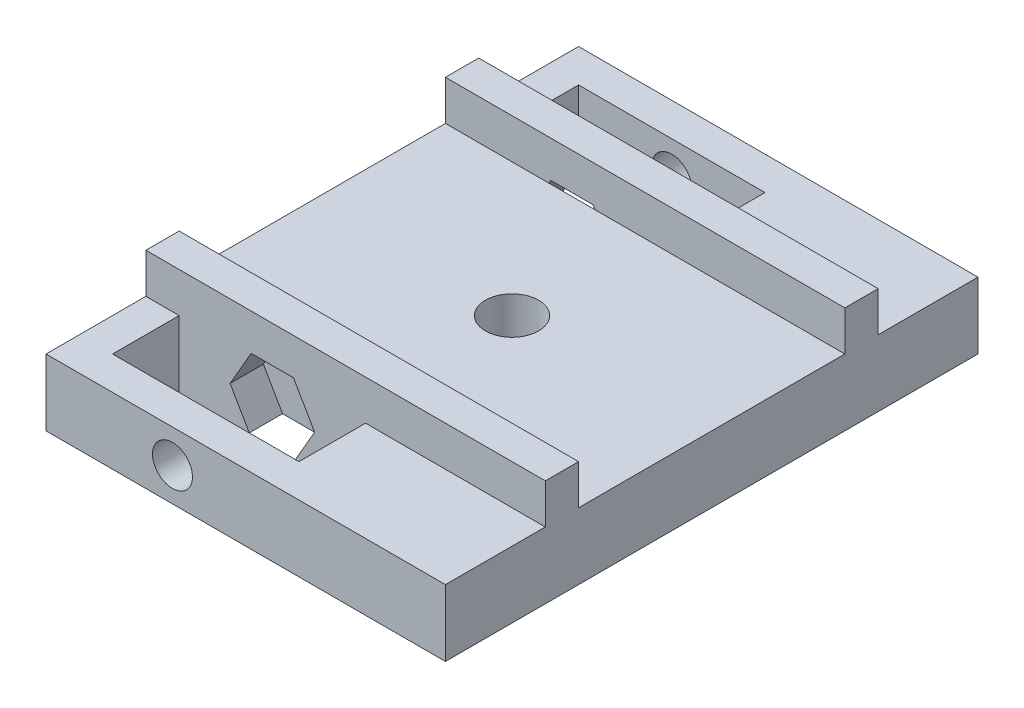
ISO-10303-21;
HEADER;
FILE_DESCRIPTION(('STEP AP214'),'2;1');
FILE_NAME('part.step','',(''),(''),'','','');
FILE_SCHEMA(('AUTOMOTIVE_DESIGN { 1 0 10303 214 1 1 1 1 }'));
ENDSEC;
DATA;
#1=APPLICATION_CONTEXT('core data for automotive mechanical design processes');
#2=APPLICATION_PROTOCOL_DEFINITION('international standard','automotive_design',2000,#1);
#3=PRODUCT_CONTEXT('',#1,'mechanical');
#4=PRODUCT('Part','Part','',(#3));
#5=PRODUCT_RELATED_PRODUCT_CATEGORY('part','',(#4));
#6=PRODUCT_DEFINITION_FORMATION('','',#4);
#7=PRODUCT_DEFINITION_CONTEXT('part definition',#1,'design');
#8=PRODUCT_DEFINITION('design','',#6,#7);
#9=PRODUCT_DEFINITION_SHAPE('','',#8);
#10=(LENGTH_UNIT() NAMED_UNIT(*) SI_UNIT(.MILLI.,.METRE.));
#11=(NAMED_UNIT(*) PLANE_ANGLE_UNIT() SI_UNIT($,.RADIAN.));
#12=(NAMED_UNIT(*) SI_UNIT($,.STERADIAN.) SOLID_ANGLE_UNIT());
#13=UNCERTAINTY_MEASURE_WITH_UNIT(LENGTH_MEASURE(1.E-05),#10,'distance_accuracy_value','');
#14=(GEOMETRIC_REPRESENTATION_CONTEXT(3) GLOBAL_UNCERTAINTY_ASSIGNED_CONTEXT((#13)) GLOBAL_UNIT_ASSIGNED_CONTEXT((#10,
#11,#12)) REPRESENTATION_CONTEXT('',''));
#15=CARTESIAN_POINT('',(0.,0.,0.));
#16=DIRECTION('',(0.,0.,1.));
#17=DIRECTION('',(1.,0.,0.));
#18=AXIS2_PLACEMENT_3D('',#15,#16,#17);
#19=CARTESIAN_POINT('',(0.,5.,0.));
#20=DIRECTION('',(0.,1.,0.));
#21=DIRECTION('',(0.,0.,1.));
#22=AXIS2_PLACEMENT_3D('',#19,#20,#21);
#23=PLANE('',#22);
#24=CARTESIAN_POINT('',(-15.,5.,10.));
#25=DIRECTION('',(0.,1.,0.));
#26=DIRECTION('',(0.,0.,1.));
#27=AXIS2_PLACEMENT_3D('',#24,#25,#26);
#28=CIRCLE('',#27,2.);
#29=CARTESIAN_POINT('',(-15.,5.,12.));
#30=VERTEX_POINT('',#29);
#31=EDGE_CURVE('E290',#30,#30,#28,.T.);
#32=ORIENTED_EDGE('',*,*,#31,.F.);
#33=EDGE_LOOP('',(#32));
#34=FACE_BOUND('',#33,.T.);
#35=DIRECTION('',(1.,0.,0.));
#36=VECTOR('',#35,1.);
#37=CARTESIAN_POINT('',(0.,5.,0.));
#38=LINE('',#37,#36);
#39=CARTESIAN_POINT('',(-18.7679491924311,5.,0.));
#40=VERTEX_POINT('',#39);
#41=CARTESIAN_POINT('',(0.,5.,0.));
#42=VERTEX_POINT('',#41);
#43=EDGE_CURVE('E437',#40,#42,#38,.T.);
#44=ORIENTED_EDGE('',*,*,#43,.F.);
#45=DIRECTION('',(-1.,0.,0.));
#46=VECTOR('',#45,1.);
#47=CARTESIAN_POINT('',(0.,5.,0.));
#48=LINE('',#47,#46);
#49=CARTESIAN_POINT('',(-22.2320508075689,5.,0.));
#50=VERTEX_POINT('',#49);
#51=EDGE_CURVE('E287',#40,#50,#48,.T.);
#52=ORIENTED_EDGE('',*,*,#51,.T.);
#53=CARTESIAN_POINT('',(-30.,5.,0.));
#54=VERTEX_POINT('',#53);
#55=EDGE_CURVE('E438',#54,#50,#38,.T.);
#56=ORIENTED_EDGE('',*,*,#55,.F.);
#57=DIRECTION('',(0.,0.,1.));
#58=VECTOR('',#57,1.);
#59=CARTESIAN_POINT('',(-30.,5.,0.));
#60=LINE('',#59,#58);
#61=CARTESIAN_POINT('',(-30.,5.,20.));
#62=VERTEX_POINT('',#61);
#63=EDGE_CURVE('E470',#54,#62,#60,.T.);
#64=ORIENTED_EDGE('',*,*,#63,.T.);
#65=DIRECTION('',(1.,0.,0.));
#66=VECTOR('',#65,1.);
#67=CARTESIAN_POINT('',(0.,5.,20.));
#68=LINE('',#67,#66);
#69=CARTESIAN_POINT('',(-22.2320508075689,5.,20.));
#70=VERTEX_POINT('',#69);
#71=EDGE_CURVE('E462',#62,#70,#68,.T.);
#72=ORIENTED_EDGE('',*,*,#71,.T.);
#73=CARTESIAN_POINT('',(-18.7679491924311,5.,20.));
#74=VERTEX_POINT('',#73);
#75=EDGE_CURVE('E466',#70,#74,#68,.T.);
#76=ORIENTED_EDGE('',*,*,#75,.T.);
#77=CARTESIAN_POINT('',(0.,5.,20.));
#78=VERTEX_POINT('',#77);
#79=EDGE_CURVE('E461',#74,#78,#68,.T.);
#80=ORIENTED_EDGE('',*,*,#79,.T.);
#81=DIRECTION('',(0.,0.,1.));
#82=VECTOR('',#81,1.);
#83=CARTESIAN_POINT('',(0.,5.,0.));
#84=LINE('',#83,#82);
#85=EDGE_CURVE('E475',#42,#78,#84,.T.);
#86=ORIENTED_EDGE('',*,*,#85,.F.);
#87=EDGE_LOOP('',(#44,#52,#56,#64,#72,#76,#80,#86));
#88=FACE_BOUND('',#87,.T.);
#89=ADVANCED_FACE('F36',(#34,#88),#23,.T.);
#90=CARTESIAN_POINT('',(0.,5.,22.5));
#91=DIRECTION('',(0.,0.,1.));
#92=DIRECTION('',(1.,0.,0.));
#93=AXIS2_PLACEMENT_3D('',#90,#91,#92);
#94=PLANE('',#93);
#95=DIRECTION('',(-1.,0.,0.));
#96=VECTOR('',#95,1.);
#97=CARTESIAN_POINT('',(0.,0.,22.5));
#98=LINE('',#97,#96);
#99=CARTESIAN_POINT('',(-22.2320508075689,0.,22.5));
#100=VERTEX_POINT('',#99);
#101=CARTESIAN_POINT('',(-27.5,0.,22.5));
#102=VERTEX_POINT('',#101);
#103=EDGE_CURVE('E492',#100,#102,#98,.T.);
#104=ORIENTED_EDGE('',*,*,#103,.F.);
#105=DIRECTION('',(-0.5,0.866025403784439,0.));
#106=VECTOR('',#105,1.);
#107=CARTESIAN_POINT('',(-16.6740381056767,-9.6267603887905,22.5));
#108=LINE('',#107,#106);
#109=CARTESIAN_POINT('',(-23.675426480543,2.5,22.5));
#110=VERTEX_POINT('',#109);
#111=EDGE_CURVE('E302',#100,#110,#108,.T.);
#112=ORIENTED_EDGE('',*,*,#111,.T.);
#113=DIRECTION('',(0.499999999999999,0.866025403784439,0.));
#114=VECTOR('',#113,1.);
#115=CARTESIAN_POINT('',(-18.8391016151378,10.8767603887905,22.5));
#116=LINE('',#115,#114);
#117=CARTESIAN_POINT('',(-22.0877132402715,5.25000000000002,22.5));
#118=VERTEX_POINT('',#117);
#119=EDGE_CURVE('E325',#110,#118,#116,.T.);
#120=ORIENTED_EDGE('',*,*,#119,.T.);
#121=DIRECTION('',(1.,0.,0.));
#122=VECTOR('',#121,1.);
#123=CARTESIAN_POINT('',(0.,5.25000000000002,22.5));
#124=LINE('',#123,#122);
#125=CARTESIAN_POINT('',(-18.9122867597285,5.25000000000002,22.5));
#126=VERTEX_POINT('',#125);
#127=EDGE_CURVE('E322',#118,#126,#124,.T.);
#128=ORIENTED_EDGE('',*,*,#127,.T.);
#129=DIRECTION('',(0.5,-0.866025403784438,0.));
#130=VECTOR('',#129,1.);
#131=CARTESIAN_POINT('',(-11.9108983848622,-6.87676038879049,22.5));
#132=LINE('',#131,#130);
#133=CARTESIAN_POINT('',(-17.324573519457,2.5,22.5));
#134=VERTEX_POINT('',#133);
#135=EDGE_CURVE('E319',#126,#134,#132,.T.);
#136=ORIENTED_EDGE('',*,*,#135,.T.);
#137=DIRECTION('',(-0.5,-0.866025403784439,0.));
#138=VECTOR('',#137,1.);
#139=CARTESIAN_POINT('',(-14.0759618943233,8.12676038879049,22.5));
#140=LINE('',#139,#138);
#141=CARTESIAN_POINT('',(-18.7679491924311,0.,22.5));
#142=VERTEX_POINT('',#141);
#143=EDGE_CURVE('E295',#134,#142,#140,.T.);
#144=ORIENTED_EDGE('',*,*,#143,.T.);
#145=CARTESIAN_POINT('',(-13.5,0.,22.5));
#146=VERTEX_POINT('',#145);
#147=EDGE_CURVE('E493',#146,#142,#98,.T.);
#148=ORIENTED_EDGE('',*,*,#147,.F.);
#149=DIRECTION('',(0.,-1.,0.));
#150=VECTOR('',#149,1.);
#151=CARTESIAN_POINT('',(-13.5,5.,22.5));
#152=LINE('',#151,#150);
#153=CARTESIAN_POINT('',(-13.5,5.,22.5));
#154=VERTEX_POINT('',#153);
#155=EDGE_CURVE('E383',#154,#146,#152,.T.);
#156=ORIENTED_EDGE('',*,*,#155,.F.);
#157=DIRECTION('',(-1.,0.,0.));
#158=VECTOR('',#157,1.);
#159=CARTESIAN_POINT('',(0.,5.,22.5));
#160=LINE('',#159,#158);
#161=CARTESIAN_POINT('',(0.,5.,22.5));
#162=VERTEX_POINT('',#161);
#163=EDGE_CURVE('E391',#162,#154,#160,.T.);
#164=ORIENTED_EDGE('',*,*,#163,.F.);
#165=DIRECTION('',(0.,-1.,0.));
#166=VECTOR('',#165,1.);
#167=CARTESIAN_POINT('',(0.,5.,22.5));
#168=LINE('',#167,#166);
#169=CARTESIAN_POINT('',(0.,8.,22.5));
#170=VERTEX_POINT('',#169);
#171=EDGE_CURVE('E520',#170,#162,#168,.T.);
#172=ORIENTED_EDGE('',*,*,#171,.F.);
#173=DIRECTION('',(-1.,0.,0.));
#174=VECTOR('',#173,1.);
#175=CARTESIAN_POINT('',(0.,8.,22.5));
#176=LINE('',#175,#174);
#177=CARTESIAN_POINT('',(-30.,8.,22.5));
#178=VERTEX_POINT('',#177);
#179=EDGE_CURVE('E447',#170,#178,#176,.T.);
#180=ORIENTED_EDGE('',*,*,#179,.T.);
#181=DIRECTION('',(0.,-1.,0.));
#182=VECTOR('',#181,1.);
#183=CARTESIAN_POINT('',(-30.,5.,22.5));
#184=LINE('',#183,#182);
#185=CARTESIAN_POINT('',(-30.,5.,22.5));
#186=VERTEX_POINT('',#185);
#187=EDGE_CURVE('E523',#178,#186,#184,.T.);
#188=ORIENTED_EDGE('',*,*,#187,.T.);
#189=CARTESIAN_POINT('',(-27.5,5.,22.5));
#190=VERTEX_POINT('',#189);
#191=EDGE_CURVE('E385',#190,#186,#160,.T.);
#192=ORIENTED_EDGE('',*,*,#191,.F.);
#193=DIRECTION('',(0.,-1.,0.));
#194=VECTOR('',#193,1.);
#195=CARTESIAN_POINT('',(-27.5,5.,22.5));
#196=LINE('',#195,#194);
#197=EDGE_CURVE('E375',#190,#102,#196,.T.);
#198=ORIENTED_EDGE('',*,*,#197,.T.);
#199=EDGE_LOOP('',(#104,#112,#120,#128,#136,#144,#148,#156,#164,#172,#180,#188,#192,#198));
#200=FACE_BOUND('',#199,.T.);
#201=ADVANCED_FACE('F574',(#200),#94,.T.);
#202=CARTESIAN_POINT('',(0.,0.,0.));
#203=DIRECTION('',(0.,1.,0.));
#204=DIRECTION('',(0.,0.,1.));
#205=AXIS2_PLACEMENT_3D('',#202,#203,#204);
#206=PLANE('',#205);
#207=CARTESIAN_POINT('',(-15.,0.,10.));
#208=DIRECTION('',(0.,1.,0.));
#209=DIRECTION('',(0.,0.,1.));
#210=AXIS2_PLACEMENT_3D('',#207,#208,#209);
#211=CIRCLE('',#210,2.);
#212=CARTESIAN_POINT('',(-15.,0.,12.));
#213=VERTEX_POINT('',#212);
#214=EDGE_CURVE('E292',#213,#213,#211,.T.);
#215=ORIENTED_EDGE('',*,*,#214,.T.);
#216=EDGE_LOOP('',(#215));
#217=FACE_BOUND('',#216,.T.);
#218=DIRECTION('',(-1.,0.,0.));
#219=VECTOR('',#218,1.);
#220=CARTESIAN_POINT('',(0.,0.,30.));
#221=LINE('',#220,#219);
#222=CARTESIAN_POINT('',(0.,0.,30.));
#223=VERTEX_POINT('',#222);
#224=CARTESIAN_POINT('',(-30.,0.,30.));
#225=VERTEX_POINT('',#224);
#226=EDGE_CURVE('E344',#223,#225,#221,.T.);
#227=ORIENTED_EDGE('',*,*,#226,.T.);
#228=DIRECTION('',(0.,0.,1.));
#229=VECTOR('',#228,1.);
#230=CARTESIAN_POINT('',(-30.,0.,0.));
#231=LINE('',#230,#229);
#232=CARTESIAN_POINT('',(-30.,0.,-10.));
#233=VERTEX_POINT('',#232);
#234=EDGE_CURVE('E490',#233,#225,#231,.T.);
#235=ORIENTED_EDGE('',*,*,#234,.F.);
#236=DIRECTION('',(-1.,0.,0.));
#237=VECTOR('',#236,1.);
#238=CARTESIAN_POINT('',(0.,0.,-10.));
#239=LINE('',#238,#237);
#240=CARTESIAN_POINT('',(0.,0.,-10.));
#241=VERTEX_POINT('',#240);
#242=EDGE_CURVE('E465',#241,#233,#239,.T.);
#243=ORIENTED_EDGE('',*,*,#242,.F.);
#244=DIRECTION('',(0.,0.,1.));
#245=VECTOR('',#244,1.);
#246=CARTESIAN_POINT('',(0.,0.,0.));
#247=LINE('',#246,#245);
#248=EDGE_CURVE('E496',#241,#223,#247,.T.);
#249=ORIENTED_EDGE('',*,*,#248,.T.);
#250=EDGE_LOOP('',(#227,#235,#243,#249));
#251=FACE_BOUND('',#250,.T.);
#252=DIRECTION('',(-1.,0.,0.));
#253=VECTOR('',#252,1.);
#254=CARTESIAN_POINT('',(0.,0.,0.));
#255=LINE('',#254,#253);
#256=CARTESIAN_POINT('',(-18.7679491924311,0.,0.));
#257=VERTEX_POINT('',#256);
#258=CARTESIAN_POINT('',(-22.2320508075689,0.,0.));
#259=VERTEX_POINT('',#258);
#260=EDGE_CURVE('E263',#257,#259,#255,.T.);
#261=ORIENTED_EDGE('',*,*,#260,.F.);
#262=DIRECTION('',(0.,0.,-1.));
#263=VECTOR('',#262,1.);
#264=CARTESIAN_POINT('',(-18.7679491924311,0.,0.));
#265=LINE('',#264,#263);
#266=CARTESIAN_POINT('',(-18.7679491924311,0.,-2.5));
#267=VERTEX_POINT('',#266);
#268=EDGE_CURVE('E291',#257,#267,#265,.T.);
#269=ORIENTED_EDGE('',*,*,#268,.T.);
#270=DIRECTION('',(1.,0.,0.));
#271=VECTOR('',#270,1.);
#272=CARTESIAN_POINT('',(0.,0.,-2.5));
#273=LINE('',#272,#271);
#274=CARTESIAN_POINT('',(-13.5,0.,-2.5));
#275=VERTEX_POINT('',#274);
#276=EDGE_CURVE('E498',#267,#275,#273,.T.);
#277=ORIENTED_EDGE('',*,*,#276,.T.);
#278=DIRECTION('',(0.,0.,-1.));
#279=VECTOR('',#278,1.);
#280=CARTESIAN_POINT('',(-13.5,0.,0.));
#281=LINE('',#280,#279);
#282=CARTESIAN_POINT('',(-13.5,0.,-7.5));
#283=VERTEX_POINT('',#282);
#284=EDGE_CURVE('E471',#275,#283,#281,.T.);
#285=ORIENTED_EDGE('',*,*,#284,.T.);
#286=DIRECTION('',(1.,0.,0.));
#287=VECTOR('',#286,1.);
#288=CARTESIAN_POINT('',(0.,0.,-7.5));
#289=LINE('',#288,#287);
#290=CARTESIAN_POINT('',(-27.5,0.,-7.5));
#291=VERTEX_POINT('',#290);
#292=EDGE_CURVE('E503',#291,#283,#289,.T.);
#293=ORIENTED_EDGE('',*,*,#292,.F.);
#294=DIRECTION('',(0.,0.,-1.));
#295=VECTOR('',#294,1.);
#296=CARTESIAN_POINT('',(-27.5,0.,0.));
#297=LINE('',#296,#295);
#298=CARTESIAN_POINT('',(-27.5,0.,-2.5));
#299=VERTEX_POINT('',#298);
#300=EDGE_CURVE('E500',#299,#291,#297,.T.);
#301=ORIENTED_EDGE('',*,*,#300,.F.);
#302=CARTESIAN_POINT('',(-22.2320508075689,0.,-2.5));
#303=VERTEX_POINT('',#302);
#304=EDGE_CURVE('E279',#299,#303,#273,.T.);
#305=ORIENTED_EDGE('',*,*,#304,.T.);
#306=DIRECTION('',(0.,0.,-1.));
#307=VECTOR('',#306,1.);
#308=CARTESIAN_POINT('',(-22.2320508075689,0.,0.));
#309=LINE('',#308,#307);
#310=EDGE_CURVE('E51',#259,#303,#309,.T.);
#311=ORIENTED_EDGE('',*,*,#310,.F.);
#312=EDGE_LOOP('',(#261,#269,#277,#285,#293,#301,#305,#311));
#313=FACE_BOUND('',#312,.T.);
#314=DIRECTION('',(0.,0.,1.));
#315=VECTOR('',#314,1.);
#316=CARTESIAN_POINT('',(-22.2320508075689,0.,20.));
#317=LINE('',#316,#315);
#318=CARTESIAN_POINT('',(-22.2320508075689,0.,20.));
#319=VERTEX_POINT('',#318);
#320=EDGE_CURVE('E59',#319,#100,#317,.T.);
#321=ORIENTED_EDGE('',*,*,#320,.T.);
#322=ORIENTED_EDGE('',*,*,#103,.T.);
#323=DIRECTION('',(0.,0.,1.));
#324=VECTOR('',#323,1.);
#325=CARTESIAN_POINT('',(-27.5,0.,20.));
#326=LINE('',#325,#324);
#327=CARTESIAN_POINT('',(-27.5,0.,27.5));
#328=VERTEX_POINT('',#327);
#329=EDGE_CURVE('E351',#102,#328,#326,.T.);
#330=ORIENTED_EDGE('',*,*,#329,.T.);
#331=DIRECTION('',(1.,0.,0.));
#332=VECTOR('',#331,1.);
#333=CARTESIAN_POINT('',(0.,0.,27.5));
#334=LINE('',#333,#332);
#335=CARTESIAN_POINT('',(-13.5,0.,27.5));
#336=VERTEX_POINT('',#335);
#337=EDGE_CURVE('E370',#328,#336,#334,.T.);
#338=ORIENTED_EDGE('',*,*,#337,.T.);
#339=DIRECTION('',(0.,0.,1.));
#340=VECTOR('',#339,1.);
#341=CARTESIAN_POINT('',(-13.5,0.,20.));
#342=LINE('',#341,#340);
#343=EDGE_CURVE('E367',#146,#336,#342,.T.);
#344=ORIENTED_EDGE('',*,*,#343,.F.);
#345=ORIENTED_EDGE('',*,*,#147,.T.);
#346=DIRECTION('',(0.,0.,1.));
#347=VECTOR('',#346,1.);
#348=CARTESIAN_POINT('',(-18.7679491924311,0.,20.));
#349=LINE('',#348,#347);
#350=CARTESIAN_POINT('',(-18.7679491924311,0.,20.));
#351=VERTEX_POINT('',#350);
#352=EDGE_CURVE('E316',#351,#142,#349,.T.);
#353=ORIENTED_EDGE('',*,*,#352,.F.);
#354=DIRECTION('',(-1.,0.,0.));
#355=VECTOR('',#354,1.);
#356=CARTESIAN_POINT('',(0.,0.,20.));
#357=LINE('',#356,#355);
#358=EDGE_CURVE('E298',#351,#319,#357,.T.);
#359=ORIENTED_EDGE('',*,*,#358,.T.);
#360=EDGE_LOOP('',(#321,#322,#330,#338,#344,#345,#353,#359));
#361=FACE_BOUND('',#360,.T.);
#362=ADVANCED_FACE('F275',(#217,#251,#313,#361),#206,.F.);
#363=CARTESIAN_POINT('',(0.,8.,20.));
#364=DIRECTION('',(0.,0.,1.));
#365=DIRECTION('',(1.,0.,0.));
#366=AXIS2_PLACEMENT_3D('',#363,#364,#365);
#367=PLANE('',#366);
#368=DIRECTION('',(0.499999999999999,0.866025403784439,0.));
#369=VECTOR('',#368,1.);
#370=CARTESIAN_POINT('',(-15.375,16.8767603887905,20.));
#371=LINE('',#370,#369);
#372=CARTESIAN_POINT('',(-22.0877132402715,5.25000000000002,20.));
#373=VERTEX_POINT('',#372);
#374=EDGE_CURVE('E11',#70,#373,#371,.T.);
#375=ORIENTED_EDGE('',*,*,#374,.F.);
#376=ORIENTED_EDGE('',*,*,#71,.F.);
#377=DIRECTION('',(0.,-1.,0.));
#378=VECTOR('',#377,1.);
#379=CARTESIAN_POINT('',(-30.,8.,20.));
#380=LINE('',#379,#378);
#381=CARTESIAN_POINT('',(-30.,8.,20.));
#382=VERTEX_POINT('',#381);
#383=EDGE_CURVE('E455',#382,#62,#380,.T.);
#384=ORIENTED_EDGE('',*,*,#383,.F.);
#385=DIRECTION('',(-1.,0.,0.));
#386=VECTOR('',#385,1.);
#387=CARTESIAN_POINT('',(0.,8.,20.));
#388=LINE('',#387,#386);
#389=CARTESIAN_POINT('',(0.,8.,20.));
#390=VERTEX_POINT('',#389);
#391=EDGE_CURVE('E453',#390,#382,#388,.T.);
#392=ORIENTED_EDGE('',*,*,#391,.F.);
#393=DIRECTION('',(0.,-1.,0.));
#394=VECTOR('',#393,1.);
#395=CARTESIAN_POINT('',(0.,8.,20.));
#396=LINE('',#395,#394);
#397=EDGE_CURVE('E458',#390,#78,#396,.T.);
#398=ORIENTED_EDGE('',*,*,#397,.T.);
#399=ORIENTED_EDGE('',*,*,#79,.F.);
#400=DIRECTION('',(0.5,-0.866025403784438,0.));
#401=VECTOR('',#400,1.);
#402=CARTESIAN_POINT('',(-11.9108983848622,-6.87676038879049,20.));
#403=LINE('',#402,#401);
#404=CARTESIAN_POINT('',(-18.9122867597285,5.25000000000002,20.));
#405=VERTEX_POINT('',#404);
#406=EDGE_CURVE('E305',#405,#74,#403,.T.);
#407=ORIENTED_EDGE('',*,*,#406,.F.);
#408=DIRECTION('',(1.,0.,0.));
#409=VECTOR('',#408,1.);
#410=CARTESIAN_POINT('',(0.,5.25000000000002,20.));
#411=LINE('',#410,#409);
#412=EDGE_CURVE('E308',#373,#405,#411,.T.);
#413=ORIENTED_EDGE('',*,*,#412,.F.);
#414=EDGE_LOOP('',(#375,#376,#384,#392,#398,#399,#407,#413));
#415=FACE_BOUND('',#414,.T.);
#416=ADVANCED_FACE('F547',(#415),#367,.F.);
#417=DIRECTION('',(-1.,0.,0.));
#418=VECTOR('',#417,1.);
#419=CARTESIAN_POINT('',(0.,5.,-2.5));
#420=LINE('',#419,#418);
#421=CARTESIAN_POINT('',(0.,5.,-2.5));
#422=VERTEX_POINT('',#421);
#423=CARTESIAN_POINT('',(-13.5,5.,-2.5));
#424=VERTEX_POINT('',#423);
#425=EDGE_CURVE('E442',#422,#424,#420,.T.);
#426=ORIENTED_EDGE('',*,*,#425,.F.);
#427=CARTESIAN_POINT('',(0.,5.,-10.));
#428=VERTEX_POINT('',#427);
#429=EDGE_CURVE('E476',#428,#422,#84,.T.);
#430=ORIENTED_EDGE('',*,*,#429,.F.);
#431=DIRECTION('',(-1.,0.,0.));
#432=VECTOR('',#431,1.);
#433=CARTESIAN_POINT('',(0.,5.,-10.));
#434=LINE('',#433,#432);
#435=CARTESIAN_POINT('',(-30.,5.,-10.));
#436=VERTEX_POINT('',#435);
#437=EDGE_CURVE('E467',#428,#436,#434,.T.);
#438=ORIENTED_EDGE('',*,*,#437,.T.);
#439=CARTESIAN_POINT('',(-30.,5.,-2.5));
#440=VERTEX_POINT('',#439);
#441=EDGE_CURVE('E472',#436,#440,#60,.T.);
#442=ORIENTED_EDGE('',*,*,#441,.T.);
#443=CARTESIAN_POINT('',(-27.5,5.,-2.5));
#444=VERTEX_POINT('',#443);
#445=EDGE_CURVE('E441',#444,#440,#420,.T.);
#446=ORIENTED_EDGE('',*,*,#445,.F.);
#447=DIRECTION('',(0.,0.,-1.));
#448=VECTOR('',#447,1.);
#449=CARTESIAN_POINT('',(-27.5,5.,0.));
#450=LINE('',#449,#448);
#451=CARTESIAN_POINT('',(-27.5,5.,-7.5));
#452=VERTEX_POINT('',#451);
#453=EDGE_CURVE('E479',#444,#452,#450,.T.);
#454=ORIENTED_EDGE('',*,*,#453,.T.);
#455=DIRECTION('',(1.,0.,0.));
#456=VECTOR('',#455,1.);
#457=CARTESIAN_POINT('',(0.,5.,-7.5));
#458=LINE('',#457,#456);
#459=CARTESIAN_POINT('',(-13.5,5.,-7.5));
#460=VERTEX_POINT('',#459);
#461=EDGE_CURVE('E482',#452,#460,#458,.T.);
#462=ORIENTED_EDGE('',*,*,#461,.T.);
#463=DIRECTION('',(0.,0.,-1.));
#464=VECTOR('',#463,1.);
#465=CARTESIAN_POINT('',(-13.5,5.,0.));
#466=LINE('',#465,#464);
#467=EDGE_CURVE('E484',#424,#460,#466,.T.);
#468=ORIENTED_EDGE('',*,*,#467,.F.);
#469=EDGE_LOOP('',(#426,#430,#438,#442,#446,#454,#462,#468));
#470=FACE_BOUND('',#469,.T.);
#471=ADVANCED_FACE('F632',(#470),#23,.T.);
#472=CARTESIAN_POINT('',(0.,5.,-2.5));
#473=DIRECTION('',(0.,0.,-1.));
#474=DIRECTION('',(-1.,0.,0.));
#475=AXIS2_PLACEMENT_3D('',#472,#473,#474);
#476=PLANE('',#475);
#477=DIRECTION('',(-0.5,-0.866025403784439,0.));
#478=VECTOR('',#477,1.);
#479=CARTESIAN_POINT('',(-14.0759618943233,8.12676038879049,-2.5));
#480=LINE('',#479,#478);
#481=CARTESIAN_POINT('',(-17.324573519457,2.5,-2.5));
#482=VERTEX_POINT('',#481);
#483=EDGE_CURVE('E272',#482,#267,#480,.T.);
#484=ORIENTED_EDGE('',*,*,#483,.F.);
#485=DIRECTION('',(0.5,-0.866025403784438,0.));
#486=VECTOR('',#485,1.);
#487=CARTESIAN_POINT('',(-11.9108983848622,-6.87676038879049,-2.5));
#488=LINE('',#487,#486);
#489=CARTESIAN_POINT('',(-18.9122867597285,5.25000000000002,-2.5));
#490=VERTEX_POINT('',#489);
#491=EDGE_CURVE('E396',#490,#482,#488,.T.);
#492=ORIENTED_EDGE('',*,*,#491,.F.);
#493=DIRECTION('',(1.,0.,0.));
#494=VECTOR('',#493,1.);
#495=CARTESIAN_POINT('',(0.,5.25000000000002,-2.5));
#496=LINE('',#495,#494);
#497=CARTESIAN_POINT('',(-22.0877132402715,5.25000000000002,-2.5));
#498=VERTEX_POINT('',#497);
#499=EDGE_CURVE('E402',#498,#490,#496,.T.);
#500=ORIENTED_EDGE('',*,*,#499,.F.);
#501=DIRECTION('',(0.499999999999999,0.866025403784439,0.));
#502=VECTOR('',#501,1.);
#503=CARTESIAN_POINT('',(-18.8391016151378,10.8767603887905,-2.5));
#504=LINE('',#503,#502);
#505=CARTESIAN_POINT('',(-23.675426480543,2.5,-2.5));
#506=VERTEX_POINT('',#505);
#507=EDGE_CURVE('E400',#506,#498,#504,.T.);
#508=ORIENTED_EDGE('',*,*,#507,.F.);
#509=DIRECTION('',(-0.5,0.866025403784439,0.));
#510=VECTOR('',#509,1.);
#511=CARTESIAN_POINT('',(-16.6740381056767,-9.6267603887905,-2.5));
#512=LINE('',#511,#510);
#513=EDGE_CURVE('E593',#303,#506,#512,.T.);
#514=ORIENTED_EDGE('',*,*,#513,.F.);
#515=ORIENTED_EDGE('',*,*,#304,.F.);
#516=DIRECTION('',(0.,-1.,0.));
#517=VECTOR('',#516,1.);
#518=CARTESIAN_POINT('',(-27.5,5.,-2.5));
#519=LINE('',#518,#517);
#520=EDGE_CURVE('E517',#444,#299,#519,.T.);
#521=ORIENTED_EDGE('',*,*,#520,.F.);
#522=ORIENTED_EDGE('',*,*,#445,.T.);
#523=DIRECTION('',(0.,-1.,0.));
#524=VECTOR('',#523,1.);
#525=CARTESIAN_POINT('',(-30.,8.,-2.5));
#526=LINE('',#525,#524);
#527=CARTESIAN_POINT('',(-30.,8.,-2.5));
#528=VERTEX_POINT('',#527);
#529=EDGE_CURVE('E434',#528,#440,#526,.T.);
#530=ORIENTED_EDGE('',*,*,#529,.F.);
#531=DIRECTION('',(1.,0.,0.));
#532=VECTOR('',#531,1.);
#533=CARTESIAN_POINT('',(0.,8.,-2.5));
#534=LINE('',#533,#532);
#535=CARTESIAN_POINT('',(0.,8.,-2.5));
#536=VERTEX_POINT('',#535);
#537=EDGE_CURVE('E414',#528,#536,#534,.T.);
#538=ORIENTED_EDGE('',*,*,#537,.T.);
#539=DIRECTION('',(0.,-1.,0.));
#540=VECTOR('',#539,1.);
#541=CARTESIAN_POINT('',(0.,8.,-2.5));
#542=LINE('',#541,#540);
#543=EDGE_CURVE('E427',#536,#422,#542,.T.);
#544=ORIENTED_EDGE('',*,*,#543,.T.);
#545=ORIENTED_EDGE('',*,*,#425,.T.);
#546=DIRECTION('',(0.,-1.,0.));
#547=VECTOR('',#546,1.);
#548=CARTESIAN_POINT('',(-13.5,5.,-2.5));
#549=LINE('',#548,#547);
#550=EDGE_CURVE('E508',#424,#275,#549,.T.);
#551=ORIENTED_EDGE('',*,*,#550,.T.);
#552=ORIENTED_EDGE('',*,*,#276,.F.);
#553=EDGE_LOOP('',(#484,#492,#500,#508,#514,#515,#521,#522,#530,#538,#544,#545,#551,#552));
#554=FACE_BOUND('',#553,.T.);
#555=ADVANCED_FACE('F602',(#554),#476,.T.);
#556=CARTESIAN_POINT('',(-27.5,5.,0.));
#557=DIRECTION('',(-1.,0.,0.));
#558=DIRECTION('',(0.,0.,1.));
#559=AXIS2_PLACEMENT_3D('',#556,#557,#558);
#560=PLANE('',#559);
#561=ORIENTED_EDGE('',*,*,#300,.T.);
#562=DIRECTION('',(0.,-1.,0.));
#563=VECTOR('',#562,1.);
#564=CARTESIAN_POINT('',(-27.5,5.,-7.5));
#565=LINE('',#564,#563);
#566=EDGE_CURVE('E514',#452,#291,#565,.T.);
#567=ORIENTED_EDGE('',*,*,#566,.F.);
#568=ORIENTED_EDGE('',*,*,#453,.F.);
#569=ORIENTED_EDGE('',*,*,#520,.T.);
#570=EDGE_LOOP('',(#561,#567,#568,#569));
#571=FACE_BOUND('',#570,.T.);
#572=ADVANCED_FACE('F615',(#571),#560,.F.);
#573=CARTESIAN_POINT('',(0.,5.,-7.5));
#574=DIRECTION('',(0.,0.,-1.));
#575=DIRECTION('',(-1.,0.,0.));
#576=AXIS2_PLACEMENT_3D('',#573,#574,#575);
#577=PLANE('',#576);
#578=CARTESIAN_POINT('',(-20.5,2.5,-7.5));
#579=DIRECTION('',(0.,0.,-1.));
#580=DIRECTION('',(-1.,0.,0.));
#581=AXIS2_PLACEMENT_3D('',#578,#579,#580);
#582=CIRCLE('',#581,1.5);
#583=CARTESIAN_POINT('',(-22.,2.5,-7.5));
#584=VERTEX_POINT('',#583);
#585=EDGE_CURVE('E411',#584,#584,#582,.T.);
#586=ORIENTED_EDGE('',*,*,#585,.T.);
#587=EDGE_LOOP('',(#586));
#588=FACE_BOUND('',#587,.T.);
#589=ORIENTED_EDGE('',*,*,#292,.T.);
#590=DIRECTION('',(0.,-1.,0.));
#591=VECTOR('',#590,1.);
#592=CARTESIAN_POINT('',(-13.5,5.,-7.5));
#593=LINE('',#592,#591);
#594=EDGE_CURVE('E511',#460,#283,#593,.T.);
#595=ORIENTED_EDGE('',*,*,#594,.F.);
#596=ORIENTED_EDGE('',*,*,#461,.F.);
#597=ORIENTED_EDGE('',*,*,#566,.T.);
#598=EDGE_LOOP('',(#589,#595,#596,#597));
#599=FACE_BOUND('',#598,.T.);
#600=ADVANCED_FACE('F611',(#588,#599),#577,.F.);
#601=CARTESIAN_POINT('',(0.,5.,-10.));
#602=DIRECTION('',(0.,0.,1.));
#603=DIRECTION('',(1.,0.,0.));
#604=AXIS2_PLACEMENT_3D('',#601,#602,#603);
#605=PLANE('',#604);
#606=CARTESIAN_POINT('',(-20.5,2.5,-10.));
#607=DIRECTION('',(0.,0.,-1.));
#608=DIRECTION('',(-1.,0.,0.));
#609=AXIS2_PLACEMENT_3D('',#606,#607,#608);
#610=CIRCLE('',#609,1.5);
#611=CARTESIAN_POINT('',(-22.,2.5,-10.));
#612=VERTEX_POINT('',#611);
#613=EDGE_CURVE('E408',#612,#612,#610,.T.);
#614=ORIENTED_EDGE('',*,*,#613,.F.);
#615=EDGE_LOOP('',(#614));
#616=FACE_BOUND('',#615,.T.);
#617=ORIENTED_EDGE('',*,*,#242,.T.);
#618=DIRECTION('',(0.,-1.,0.));
#619=VECTOR('',#618,1.);
#620=CARTESIAN_POINT('',(-30.,5.,-10.));
#621=LINE('',#620,#619);
#622=EDGE_CURVE('E512',#436,#233,#621,.T.);
#623=ORIENTED_EDGE('',*,*,#622,.F.);
#624=ORIENTED_EDGE('',*,*,#437,.F.);
#625=DIRECTION('',(0.,-1.,0.));
#626=VECTOR('',#625,1.);
#627=CARTESIAN_POINT('',(0.,5.,-10.));
#628=LINE('',#627,#626);
#629=EDGE_CURVE('E487',#428,#241,#628,.T.);
#630=ORIENTED_EDGE('',*,*,#629,.T.);
#631=EDGE_LOOP('',(#617,#623,#624,#630));
#632=FACE_BOUND('',#631,.T.);
#633=ADVANCED_FACE('F38',(#616,#632),#605,.F.);
#634=CARTESIAN_POINT('',(-30.,5.,0.));
#635=DIRECTION('',(1.,0.,0.));
#636=DIRECTION('',(0.,0.,-1.));
#637=AXIS2_PLACEMENT_3D('',#634,#635,#636);
#638=PLANE('',#637);
#639=ORIENTED_EDGE('',*,*,#383,.T.);
#640=ORIENTED_EDGE('',*,*,#63,.F.);
#641=DIRECTION('',(0.,-1.,0.));
#642=VECTOR('',#641,1.);
#643=CARTESIAN_POINT('',(-30.,8.,0.));
#644=LINE('',#643,#642);
#645=CARTESIAN_POINT('',(-30.,8.,0.));
#646=VERTEX_POINT('',#645);
#647=EDGE_CURVE('E432',#646,#54,#644,.T.);
#648=ORIENTED_EDGE('',*,*,#647,.F.);
#649=DIRECTION('',(0.,0.,-1.));
#650=VECTOR('',#649,1.);
#651=CARTESIAN_POINT('',(-30.,8.,0.));
#652=LINE('',#651,#650);
#653=EDGE_CURVE('E419',#646,#528,#652,.T.);
#654=ORIENTED_EDGE('',*,*,#653,.T.);
#655=ORIENTED_EDGE('',*,*,#529,.T.);
#656=ORIENTED_EDGE('',*,*,#441,.F.);
#657=ORIENTED_EDGE('',*,*,#622,.T.);
#658=ORIENTED_EDGE('',*,*,#234,.T.);
#659=DIRECTION('',(0.,-1.,0.));
#660=VECTOR('',#659,1.);
#661=CARTESIAN_POINT('',(-30.,5.,30.));
#662=LINE('',#661,#660);
#663=CARTESIAN_POINT('',(-30.,5.,30.));
#664=VERTEX_POINT('',#663);
#665=EDGE_CURVE('E364',#664,#225,#662,.T.);
#666=ORIENTED_EDGE('',*,*,#665,.F.);
#667=DIRECTION('',(0.,0.,-1.));
#668=VECTOR('',#667,1.);
#669=CARTESIAN_POINT('',(-30.,5.,20.));
#670=LINE('',#669,#668);
#671=EDGE_CURVE('E353',#664,#186,#670,.T.);
#672=ORIENTED_EDGE('',*,*,#671,.T.);
#673=ORIENTED_EDGE('',*,*,#187,.F.);
#674=DIRECTION('',(0.,0.,-1.));
#675=VECTOR('',#674,1.);
#676=CARTESIAN_POINT('',(-30.,8.,0.));
#677=LINE('',#676,#675);
#678=EDGE_CURVE('E444',#178,#382,#677,.T.);
#679=ORIENTED_EDGE('',*,*,#678,.T.);
#680=EDGE_LOOP('',(#639,#640,#648,#654,#655,#656,#657,#658,#666,#672,#673,#679));
#681=FACE_BOUND('',#680,.T.);
#682=ADVANCED_FACE('F540',(#681),#638,.F.);
#683=CARTESIAN_POINT('',(0.,5.,0.));
#684=DIRECTION('',(1.,0.,0.));
#685=DIRECTION('',(0.,0.,-1.));
#686=AXIS2_PLACEMENT_3D('',#683,#684,#685);
#687=PLANE('',#686);
#688=ORIENTED_EDGE('',*,*,#171,.T.);
#689=DIRECTION('',(0.,0.,-1.));
#690=VECTOR('',#689,1.);
#691=CARTESIAN_POINT('',(0.,5.,20.));
#692=LINE('',#691,#690);
#693=CARTESIAN_POINT('',(0.,5.,30.));
#694=VERTEX_POINT('',#693);
#695=EDGE_CURVE('E350',#694,#162,#692,.T.);
#696=ORIENTED_EDGE('',*,*,#695,.F.);
#697=DIRECTION('',(0.,-1.,0.));
#698=VECTOR('',#697,1.);
#699=CARTESIAN_POINT('',(0.,5.,30.));
#700=LINE('',#699,#698);
#701=EDGE_CURVE('E379',#694,#223,#700,.T.);
#702=ORIENTED_EDGE('',*,*,#701,.T.);
#703=ORIENTED_EDGE('',*,*,#248,.F.);
#704=ORIENTED_EDGE('',*,*,#629,.F.);
#705=ORIENTED_EDGE('',*,*,#429,.T.);
#706=ORIENTED_EDGE('',*,*,#543,.F.);
#707=DIRECTION('',(0.,0.,-1.));
#708=VECTOR('',#707,1.);
#709=CARTESIAN_POINT('',(0.,8.,0.));
#710=LINE('',#709,#708);
#711=CARTESIAN_POINT('',(0.,8.,0.));
#712=VERTEX_POINT('',#711);
#713=EDGE_CURVE('E425',#712,#536,#710,.T.);
#714=ORIENTED_EDGE('',*,*,#713,.F.);
#715=DIRECTION('',(0.,-1.,0.));
#716=VECTOR('',#715,1.);
#717=CARTESIAN_POINT('',(0.,8.,0.));
#718=LINE('',#717,#716);
#719=EDGE_CURVE('E429',#712,#42,#718,.T.);
#720=ORIENTED_EDGE('',*,*,#719,.T.);
#721=ORIENTED_EDGE('',*,*,#85,.T.);
#722=ORIENTED_EDGE('',*,*,#397,.F.);
#723=DIRECTION('',(0.,0.,1.));
#724=VECTOR('',#723,1.);
#725=CARTESIAN_POINT('',(0.,8.,0.));
#726=LINE('',#725,#724);
#727=EDGE_CURVE('E450',#390,#170,#726,.T.);
#728=ORIENTED_EDGE('',*,*,#727,.T.);
#729=EDGE_LOOP('',(#688,#696,#702,#703,#704,#705,#706,#714,#720,#721,#722,#728));
#730=FACE_BOUND('',#729,.T.);
#731=ADVANCED_FACE('F582',(#730),#687,.T.);
#732=CARTESIAN_POINT('',(-13.5,5.,0.));
#733=DIRECTION('',(-1.,0.,0.));
#734=DIRECTION('',(0.,0.,1.));
#735=AXIS2_PLACEMENT_3D('',#732,#733,#734);
#736=PLANE('',#735);
#737=ORIENTED_EDGE('',*,*,#284,.F.);
#738=ORIENTED_EDGE('',*,*,#550,.F.);
#739=ORIENTED_EDGE('',*,*,#467,.T.);
#740=ORIENTED_EDGE('',*,*,#594,.T.);
#741=EDGE_LOOP('',(#737,#738,#739,#740));
#742=FACE_BOUND('',#741,.T.);
#743=ADVANCED_FACE('F607',(#742),#736,.T.);
#744=CARTESIAN_POINT('',(0.,8.,0.));
#745=DIRECTION('',(0.,1.,0.));
#746=DIRECTION('',(0.,0.,1.));
#747=AXIS2_PLACEMENT_3D('',#744,#745,#746);
#748=PLANE('',#747);
#749=ORIENTED_EDGE('',*,*,#678,.F.);
#750=ORIENTED_EDGE('',*,*,#179,.F.);
#751=ORIENTED_EDGE('',*,*,#727,.F.);
#752=ORIENTED_EDGE('',*,*,#391,.T.);
#753=EDGE_LOOP('',(#749,#750,#751,#752));
#754=FACE_BOUND('',#753,.T.);
#755=ADVANCED_FACE('F667',(#754),#748,.T.);
#756=CARTESIAN_POINT('',(0.,8.,0.));
#757=DIRECTION('',(0.,0.,1.));
#758=DIRECTION('',(1.,0.,0.));
#759=AXIS2_PLACEMENT_3D('',#756,#757,#758);
#760=PLANE('',#759);
#761=DIRECTION('',(0.5,-0.866025403784438,0.));
#762=VECTOR('',#761,1.);
#763=CARTESIAN_POINT('',(-11.9108983848622,-6.87676038879049,0.));
#764=LINE('',#763,#762);
#765=CARTESIAN_POINT('',(-18.9122867597285,5.25000000000002,0.));
#766=VERTEX_POINT('',#765);
#767=EDGE_CURVE('E395',#766,#40,#764,.T.);
#768=ORIENTED_EDGE('',*,*,#767,.T.);
#769=ORIENTED_EDGE('',*,*,#43,.T.);
#770=ORIENTED_EDGE('',*,*,#719,.F.);
#771=DIRECTION('',(-1.,0.,0.));
#772=VECTOR('',#771,1.);
#773=CARTESIAN_POINT('',(0.,8.,0.));
#774=LINE('',#773,#772);
#775=EDGE_CURVE('E422',#712,#646,#774,.T.);
#776=ORIENTED_EDGE('',*,*,#775,.T.);
#777=ORIENTED_EDGE('',*,*,#647,.T.);
#778=ORIENTED_EDGE('',*,*,#55,.T.);
#779=DIRECTION('',(-0.499999999999999,-0.866025403784439,0.));
#780=VECTOR('',#779,1.);
#781=CARTESIAN_POINT('',(-15.375,16.8767603887905,0.));
#782=LINE('',#781,#780);
#783=CARTESIAN_POINT('',(-22.0877132402715,5.25000000000002,0.));
#784=VERTEX_POINT('',#783);
#785=EDGE_CURVE('E44',#784,#50,#782,.T.);
#786=ORIENTED_EDGE('',*,*,#785,.F.);
#787=DIRECTION('',(1.,0.,0.));
#788=VECTOR('',#787,1.);
#789=CARTESIAN_POINT('',(0.,5.25000000000002,0.));
#790=LINE('',#789,#788);
#791=EDGE_CURVE('E392',#784,#766,#790,.T.);
#792=ORIENTED_EDGE('',*,*,#791,.T.);
#793=EDGE_LOOP('',(#768,#769,#770,#776,#777,#778,#786,#792));
#794=FACE_BOUND('',#793,.T.);
#795=ADVANCED_FACE('F534',(#794),#760,.T.);
#796=CARTESIAN_POINT('',(0.,8.,0.));
#797=DIRECTION('',(0.,1.,0.));
#798=DIRECTION('',(0.,0.,1.));
#799=AXIS2_PLACEMENT_3D('',#796,#797,#798);
#800=PLANE('',#799);
#801=ORIENTED_EDGE('',*,*,#537,.F.);
#802=ORIENTED_EDGE('',*,*,#653,.F.);
#803=ORIENTED_EDGE('',*,*,#775,.F.);
#804=ORIENTED_EDGE('',*,*,#713,.T.);
#805=EDGE_LOOP('',(#801,#802,#803,#804));
#806=FACE_BOUND('',#805,.T.);
#807=ADVANCED_FACE('F657',(#806),#800,.T.);
#808=CARTESIAN_POINT('',(-20.5,2.5,-7.5));
#809=DIRECTION('',(0.,0.,-1.));
#810=DIRECTION('',(-1.,0.,0.));
#811=AXIS2_PLACEMENT_3D('',#808,#809,#810);
#812=CYLINDRICAL_SURFACE('',#811,1.5);
#813=ORIENTED_EDGE('',*,*,#585,.F.);
#814=EDGE_LOOP('',(#813));
#815=FACE_BOUND('',#814,.T.);
#816=ORIENTED_EDGE('',*,*,#613,.T.);
#817=EDGE_LOOP('',(#816));
#818=FACE_BOUND('',#817,.T.);
#819=ADVANCED_FACE('F627',(#815,#818),#812,.F.);
#820=CARTESIAN_POINT('',(-11.9108983848622,-6.87676038879049,0.));
#821=DIRECTION('',(0.866025403784438,0.5,0.));
#822=DIRECTION('',(-0.5,0.866025403784438,0.));
#823=AXIS2_PLACEMENT_3D('',#820,#821,#822);
#824=PLANE('',#823);
#825=ORIENTED_EDGE('',*,*,#491,.T.);
#826=DIRECTION('',(0.,0.,-1.));
#827=VECTOR('',#826,1.);
#828=CARTESIAN_POINT('',(-17.324573519457,2.5,0.));
#829=LINE('',#828,#827);
#830=CARTESIAN_POINT('',(-17.324573519457,2.5,0.));
#831=VERTEX_POINT('',#830);
#832=EDGE_CURVE('E281',#831,#482,#829,.T.);
#833=ORIENTED_EDGE('',*,*,#832,.F.);
#834=DIRECTION('',(0.5,-0.866025403784438,0.));
#835=VECTOR('',#834,1.);
#836=CARTESIAN_POINT('',(-11.9108983848622,-6.87676038879049,0.));
#837=LINE('',#836,#835);
#838=EDGE_CURVE('E283',#40,#831,#837,.T.);
#839=ORIENTED_EDGE('',*,*,#838,.F.);
#840=ORIENTED_EDGE('',*,*,#767,.F.);
#841=DIRECTION('',(0.,0.,-1.));
#842=VECTOR('',#841,1.);
#843=CARTESIAN_POINT('',(-18.9122867597285,5.25000000000002,0.));
#844=LINE('',#843,#842);
#845=EDGE_CURVE('E406',#766,#490,#844,.T.);
#846=ORIENTED_EDGE('',*,*,#845,.T.);
#847=EDGE_LOOP('',(#825,#833,#839,#840,#846));
#848=FACE_BOUND('',#847,.T.);
#849=ADVANCED_FACE('F587',(#848),#824,.F.);
#850=CARTESIAN_POINT('',(0.,5.25000000000002,0.));
#851=DIRECTION('',(0.,1.,0.));
#852=DIRECTION('',(-1.,0.,0.));
#853=AXIS2_PLACEMENT_3D('',#850,#851,#852);
#854=PLANE('',#853);
#855=ORIENTED_EDGE('',*,*,#499,.T.);
#856=ORIENTED_EDGE('',*,*,#845,.F.);
#857=ORIENTED_EDGE('',*,*,#791,.F.);
#858=DIRECTION('',(0.,0.,-1.));
#859=VECTOR('',#858,1.);
#860=CARTESIAN_POINT('',(-22.0877132402715,5.25000000000002,0.));
#861=LINE('',#860,#859);
#862=EDGE_CURVE('E399',#784,#498,#861,.T.);
#863=ORIENTED_EDGE('',*,*,#862,.T.);
#864=EDGE_LOOP('',(#855,#856,#857,#863));
#865=FACE_BOUND('',#864,.T.);
#866=ADVANCED_FACE('F618',(#865),#854,.F.);
#867=CARTESIAN_POINT('',(-18.8391016151378,10.8767603887905,0.));
#868=DIRECTION('',(-0.866025403784439,0.499999999999999,0.));
#869=DIRECTION('',(-0.499999999999999,-0.866025403784439,0.));
#870=AXIS2_PLACEMENT_3D('',#867,#868,#869);
#871=PLANE('',#870);
#872=ORIENTED_EDGE('',*,*,#785,.T.);
#873=DIRECTION('',(0.499999999999999,0.866025403784439,0.));
#874=VECTOR('',#873,1.);
#875=CARTESIAN_POINT('',(-18.8391016151378,10.8767603887905,0.));
#876=LINE('',#875,#874);
#877=CARTESIAN_POINT('',(-23.675426480543,2.5,0.));
#878=VERTEX_POINT('',#877);
#879=EDGE_CURVE('E262',#878,#50,#876,.T.);
#880=ORIENTED_EDGE('',*,*,#879,.F.);
#881=DIRECTION('',(0.,0.,-1.));
#882=VECTOR('',#881,1.);
#883=CARTESIAN_POINT('',(-23.675426480543,2.5,0.));
#884=LINE('',#883,#882);
#885=EDGE_CURVE('E259',#878,#506,#884,.T.);
#886=ORIENTED_EDGE('',*,*,#885,.T.);
#887=ORIENTED_EDGE('',*,*,#507,.T.);
#888=ORIENTED_EDGE('',*,*,#862,.F.);
#889=EDGE_LOOP('',(#872,#880,#886,#887,#888));
#890=FACE_BOUND('',#889,.T.);
#891=ADVANCED_FACE('F531',(#890),#871,.F.);
#892=CARTESIAN_POINT('',(-13.5,5.,20.));
#893=DIRECTION('',(1.,0.,0.));
#894=DIRECTION('',(0.,0.,-1.));
#895=AXIS2_PLACEMENT_3D('',#892,#893,#894);
#896=PLANE('',#895);
#897=ORIENTED_EDGE('',*,*,#343,.T.);
#898=DIRECTION('',(0.,-1.,0.));
#899=VECTOR('',#898,1.);
#900=CARTESIAN_POINT('',(-13.5,5.,27.5));
#901=LINE('',#900,#899);
#902=CARTESIAN_POINT('',(-13.5,5.,27.5));
#903=VERTEX_POINT('',#902);
#904=EDGE_CURVE('E381',#903,#336,#901,.T.);
#905=ORIENTED_EDGE('',*,*,#904,.F.);
#906=DIRECTION('',(0.,0.,1.));
#907=VECTOR('',#906,1.);
#908=CARTESIAN_POINT('',(-13.5,5.,20.));
#909=LINE('',#908,#907);
#910=EDGE_CURVE('E356',#154,#903,#909,.T.);
#911=ORIENTED_EDGE('',*,*,#910,.F.);
#912=ORIENTED_EDGE('',*,*,#155,.T.);
#913=EDGE_LOOP('',(#897,#905,#911,#912));
#914=FACE_BOUND('',#913,.T.);
#915=ADVANCED_FACE('F625',(#914),#896,.F.);
#916=CARTESIAN_POINT('',(0.,5.,27.5));
#917=DIRECTION('',(0.,0.,-1.));
#918=DIRECTION('',(-1.,0.,0.));
#919=AXIS2_PLACEMENT_3D('',#916,#917,#918);
#920=PLANE('',#919);
#921=CARTESIAN_POINT('',(-20.5,2.5,27.5));
#922=DIRECTION('',(0.,0.,-1.));
#923=DIRECTION('',(-1.,0.,0.));
#924=AXIS2_PLACEMENT_3D('',#921,#922,#923);
#925=CIRCLE('',#924,1.5);
#926=CARTESIAN_POINT('',(-22.,2.5,27.5));
#927=VERTEX_POINT('',#926);
#928=EDGE_CURVE('E341',#927,#927,#925,.T.);
#929=ORIENTED_EDGE('',*,*,#928,.F.);
#930=EDGE_LOOP('',(#929));
#931=FACE_BOUND('',#930,.T.);
#932=ORIENTED_EDGE('',*,*,#337,.F.);
#933=DIRECTION('',(0.,-1.,0.));
#934=VECTOR('',#933,1.);
#935=CARTESIAN_POINT('',(-27.5,5.,27.5));
#936=LINE('',#935,#934);
#937=CARTESIAN_POINT('',(-27.5,5.,27.5));
#938=VERTEX_POINT('',#937);
#939=EDGE_CURVE('E378',#938,#328,#936,.T.);
#940=ORIENTED_EDGE('',*,*,#939,.F.);
#941=DIRECTION('',(1.,0.,0.));
#942=VECTOR('',#941,1.);
#943=CARTESIAN_POINT('',(0.,5.,27.5));
#944=LINE('',#943,#942);
#945=EDGE_CURVE('E358',#938,#903,#944,.T.);
#946=ORIENTED_EDGE('',*,*,#945,.T.);
#947=ORIENTED_EDGE('',*,*,#904,.T.);
#948=EDGE_LOOP('',(#932,#940,#946,#947));
#949=FACE_BOUND('',#948,.T.);
#950=ADVANCED_FACE('F807',(#931,#949),#920,.T.);
#951=CARTESIAN_POINT('',(0.,5.,30.));
#952=DIRECTION('',(0.,0.,1.));
#953=DIRECTION('',(1.,0.,0.));
#954=AXIS2_PLACEMENT_3D('',#951,#952,#953);
#955=PLANE('',#954);
#956=CARTESIAN_POINT('',(-20.5,2.5,30.));
#957=DIRECTION('',(0.,0.,-1.));
#958=DIRECTION('',(-1.,0.,0.));
#959=AXIS2_PLACEMENT_3D('',#956,#957,#958);
#960=CIRCLE('',#959,1.5);
#961=CARTESIAN_POINT('',(-22.,2.5,30.));
#962=VERTEX_POINT('',#961);
#963=EDGE_CURVE('E331',#962,#962,#960,.T.);
#964=ORIENTED_EDGE('',*,*,#963,.T.);
#965=EDGE_LOOP('',(#964));
#966=FACE_BOUND('',#965,.T.);
#967=ORIENTED_EDGE('',*,*,#226,.F.);
#968=ORIENTED_EDGE('',*,*,#701,.F.);
#969=DIRECTION('',(-1.,0.,0.));
#970=VECTOR('',#969,1.);
#971=CARTESIAN_POINT('',(0.,5.,30.));
#972=LINE('',#971,#970);
#973=EDGE_CURVE('E347',#694,#664,#972,.T.);
#974=ORIENTED_EDGE('',*,*,#973,.T.);
#975=ORIENTED_EDGE('',*,*,#665,.T.);
#976=EDGE_LOOP('',(#967,#968,#974,#975));
#977=FACE_BOUND('',#976,.T.);
#978=ADVANCED_FACE('F686',(#966,#977),#955,.T.);
#979=CARTESIAN_POINT('',(-27.5,5.,20.));
#980=DIRECTION('',(1.,0.,0.));
#981=DIRECTION('',(0.,0.,-1.));
#982=AXIS2_PLACEMENT_3D('',#979,#980,#981);
#983=PLANE('',#982);
#984=ORIENTED_EDGE('',*,*,#329,.F.);
#985=ORIENTED_EDGE('',*,*,#197,.F.);
#986=DIRECTION('',(0.,0.,1.));
#987=VECTOR('',#986,1.);
#988=CARTESIAN_POINT('',(-27.5,5.,20.));
#989=LINE('',#988,#987);
#990=EDGE_CURVE('E361',#190,#938,#989,.T.);
#991=ORIENTED_EDGE('',*,*,#990,.T.);
#992=ORIENTED_EDGE('',*,*,#939,.T.);
#993=EDGE_LOOP('',(#984,#985,#991,#992));
#994=FACE_BOUND('',#993,.T.);
#995=ADVANCED_FACE('F803',(#994),#983,.T.);
#996=CARTESIAN_POINT('',(0.,5.,20.));
#997=DIRECTION('',(0.,1.,0.));
#998=DIRECTION('',(0.,0.,-1.));
#999=AXIS2_PLACEMENT_3D('',#996,#997,#998);
#1000=PLANE('',#999);
#1001=ORIENTED_EDGE('',*,*,#695,.T.);
#1002=ORIENTED_EDGE('',*,*,#163,.T.);
#1003=ORIENTED_EDGE('',*,*,#910,.T.);
#1004=ORIENTED_EDGE('',*,*,#945,.F.);
#1005=ORIENTED_EDGE('',*,*,#990,.F.);
#1006=ORIENTED_EDGE('',*,*,#191,.T.);
#1007=ORIENTED_EDGE('',*,*,#671,.F.);
#1008=ORIENTED_EDGE('',*,*,#973,.F.);
#1009=EDGE_LOOP('',(#1001,#1002,#1003,#1004,#1005,#1006,#1007,#1008));
#1010=FACE_BOUND('',#1009,.T.);
#1011=ADVANCED_FACE('F684',(#1010),#1000,.T.);
#1012=CARTESIAN_POINT('',(-20.5,2.5,27.5));
#1013=DIRECTION('',(0.,0.,1.));
#1014=DIRECTION('',(1.,0.,0.));
#1015=AXIS2_PLACEMENT_3D('',#1012,#1013,#1014);
#1016=CYLINDRICAL_SURFACE('',#1015,1.5);
#1017=ORIENTED_EDGE('',*,*,#928,.T.);
#1018=EDGE_LOOP('',(#1017));
#1019=FACE_BOUND('',#1018,.T.);
#1020=ORIENTED_EDGE('',*,*,#963,.F.);
#1021=EDGE_LOOP('',(#1020));
#1022=FACE_BOUND('',#1021,.T.);
#1023=ADVANCED_FACE('F787',(#1019,#1022),#1016,.F.);
#1024=CARTESIAN_POINT('',(-16.6740381056767,-9.6267603887905,20.));
#1025=DIRECTION('',(0.866025403784439,0.5,0.));
#1026=DIRECTION('',(-0.5,0.866025403784439,0.));
#1027=AXIS2_PLACEMENT_3D('',#1024,#1025,#1026);
#1028=PLANE('',#1027);
#1029=ORIENTED_EDGE('',*,*,#111,.F.);
#1030=ORIENTED_EDGE('',*,*,#320,.F.);
#1031=DIRECTION('',(-0.5,0.866025403784439,0.));
#1032=VECTOR('',#1031,1.);
#1033=CARTESIAN_POINT('',(-16.6740381056767,-9.6267603887905,20.));
#1034=LINE('',#1033,#1032);
#1035=CARTESIAN_POINT('',(-23.675426480543,2.5,20.));
#1036=VERTEX_POINT('',#1035);
#1037=EDGE_CURVE('E314',#319,#1036,#1034,.T.);
#1038=ORIENTED_EDGE('',*,*,#1037,.T.);
#1039=DIRECTION('',(0.,0.,1.));
#1040=VECTOR('',#1039,1.);
#1041=CARTESIAN_POINT('',(-23.675426480543,2.5,20.));
#1042=LINE('',#1041,#1040);
#1043=EDGE_CURVE('E332',#1036,#110,#1042,.T.);
#1044=ORIENTED_EDGE('',*,*,#1043,.T.);
#1045=EDGE_LOOP('',(#1029,#1030,#1038,#1044));
#1046=FACE_BOUND('',#1045,.T.);
#1047=ADVANCED_FACE('F563',(#1046),#1028,.T.);
#1048=CARTESIAN_POINT('',(-18.8391016151378,10.8767603887905,20.));
#1049=DIRECTION('',(0.866025403784439,-0.499999999999999,0.));
#1050=DIRECTION('',(0.499999999999999,0.866025403784439,0.));
#1051=AXIS2_PLACEMENT_3D('',#1048,#1049,#1050);
#1052=PLANE('',#1051);
#1053=ORIENTED_EDGE('',*,*,#119,.F.);
#1054=ORIENTED_EDGE('',*,*,#1043,.F.);
#1055=DIRECTION('',(0.499999999999999,0.866025403784439,0.));
#1056=VECTOR('',#1055,1.);
#1057=CARTESIAN_POINT('',(-18.8391016151378,10.8767603887905,20.));
#1058=LINE('',#1057,#1056);
#1059=EDGE_CURVE('E311',#1036,#70,#1058,.T.);
#1060=ORIENTED_EDGE('',*,*,#1059,.T.);
#1061=ORIENTED_EDGE('',*,*,#374,.T.);
#1062=DIRECTION('',(0.,0.,1.));
#1063=VECTOR('',#1062,1.);
#1064=CARTESIAN_POINT('',(-22.0877132402715,5.25000000000002,20.));
#1065=LINE('',#1064,#1063);
#1066=EDGE_CURVE('E334',#373,#118,#1065,.T.);
#1067=ORIENTED_EDGE('',*,*,#1066,.T.);
#1068=EDGE_LOOP('',(#1053,#1054,#1060,#1061,#1067));
#1069=FACE_BOUND('',#1068,.T.);
#1070=ADVANCED_FACE('F561',(#1069),#1052,.T.);
#1071=CARTESIAN_POINT('',(0.,5.25000000000002,20.));
#1072=DIRECTION('',(0.,-1.,0.));
#1073=DIRECTION('',(1.,0.,0.));
#1074=AXIS2_PLACEMENT_3D('',#1071,#1072,#1073);
#1075=PLANE('',#1074);
#1076=ORIENTED_EDGE('',*,*,#127,.F.);
#1077=ORIENTED_EDGE('',*,*,#1066,.F.);
#1078=ORIENTED_EDGE('',*,*,#412,.T.);
#1079=DIRECTION('',(0.,0.,1.));
#1080=VECTOR('',#1079,1.);
#1081=CARTESIAN_POINT('',(-18.9122867597285,5.25000000000002,20.));
#1082=LINE('',#1081,#1080);
#1083=EDGE_CURVE('E336',#405,#126,#1082,.T.);
#1084=ORIENTED_EDGE('',*,*,#1083,.T.);
#1085=EDGE_LOOP('',(#1076,#1077,#1078,#1084));
#1086=FACE_BOUND('',#1085,.T.);
#1087=ADVANCED_FACE('F790',(#1086),#1075,.T.);
#1088=CARTESIAN_POINT('',(-11.9108983848622,-6.87676038879049,20.));
#1089=DIRECTION('',(-0.866025403784438,-0.5,0.));
#1090=DIRECTION('',(0.5,-0.866025403784438,0.));
#1091=AXIS2_PLACEMENT_3D('',#1088,#1089,#1090);
#1092=PLANE('',#1091);
#1093=ORIENTED_EDGE('',*,*,#135,.F.);
#1094=ORIENTED_EDGE('',*,*,#1083,.F.);
#1095=ORIENTED_EDGE('',*,*,#406,.T.);
#1096=CARTESIAN_POINT('',(-17.324573519457,2.5,20.));
#1097=VERTEX_POINT('',#1096);
#1098=EDGE_CURVE('E304',#74,#1097,#403,.T.);
#1099=ORIENTED_EDGE('',*,*,#1098,.T.);
#1100=DIRECTION('',(0.,0.,1.));
#1101=VECTOR('',#1100,1.);
#1102=CARTESIAN_POINT('',(-17.324573519457,2.5,20.));
#1103=LINE('',#1102,#1101);
#1104=EDGE_CURVE('E338',#1097,#134,#1103,.T.);
#1105=ORIENTED_EDGE('',*,*,#1104,.T.);
#1106=EDGE_LOOP('',(#1093,#1094,#1095,#1099,#1105));
#1107=FACE_BOUND('',#1106,.T.);
#1108=ADVANCED_FACE('F579',(#1107),#1092,.T.);
#1109=CARTESIAN_POINT('',(-14.0759618943233,8.12676038879049,20.));
#1110=DIRECTION('',(-0.866025403784438,0.5,0.));
#1111=DIRECTION('',(-0.5,-0.866025403784439,0.));
#1112=AXIS2_PLACEMENT_3D('',#1109,#1110,#1111);
#1113=PLANE('',#1112);
#1114=ORIENTED_EDGE('',*,*,#143,.F.);
#1115=ORIENTED_EDGE('',*,*,#1104,.F.);
#1116=DIRECTION('',(-0.5,-0.866025403784439,0.));
#1117=VECTOR('',#1116,1.);
#1118=CARTESIAN_POINT('',(-14.0759618943233,8.12676038879049,20.));
#1119=LINE('',#1118,#1117);
#1120=EDGE_CURVE('E301',#1097,#351,#1119,.T.);
#1121=ORIENTED_EDGE('',*,*,#1120,.T.);
#1122=ORIENTED_EDGE('',*,*,#352,.T.);
#1123=EDGE_LOOP('',(#1114,#1115,#1121,#1122));
#1124=FACE_BOUND('',#1123,.T.);
#1125=ADVANCED_FACE('F571',(#1124),#1113,.T.);
#1126=CARTESIAN_POINT('',(0.,0.,20.));
#1127=DIRECTION('',(0.,0.,1.));
#1128=DIRECTION('',(-1.,0.,0.));
#1129=AXIS2_PLACEMENT_3D('',#1126,#1127,#1128);
#1130=PLANE('',#1129);
#1131=ORIENTED_EDGE('',*,*,#1059,.F.);
#1132=ORIENTED_EDGE('',*,*,#1037,.F.);
#1133=ORIENTED_EDGE('',*,*,#358,.F.);
#1134=ORIENTED_EDGE('',*,*,#1120,.F.);
#1135=ORIENTED_EDGE('',*,*,#1098,.F.);
#1136=ORIENTED_EDGE('',*,*,#75,.F.);
#1137=EDGE_LOOP('',(#1131,#1132,#1133,#1134,#1135,#1136));
#1138=FACE_BOUND('',#1137,.T.);
#1139=ADVANCED_FACE('F556',(#1138),#1130,.T.);
#1140=CARTESIAN_POINT('',(-15.,0.,10.));
#1141=DIRECTION('',(0.,1.,0.));
#1142=DIRECTION('',(0.,0.,1.));
#1143=AXIS2_PLACEMENT_3D('',#1140,#1141,#1142);
#1144=CYLINDRICAL_SURFACE('',#1143,2.);
#1145=ORIENTED_EDGE('',*,*,#214,.F.);
#1146=EDGE_LOOP('',(#1145));
#1147=FACE_BOUND('',#1146,.T.);
#1148=ORIENTED_EDGE('',*,*,#31,.T.);
#1149=EDGE_LOOP('',(#1148));
#1150=FACE_BOUND('',#1149,.T.);
#1151=ADVANCED_FACE('F759',(#1147,#1150),#1144,.F.);
#1152=CARTESIAN_POINT('',(-14.0759618943233,8.12676038879049,0.));
#1153=DIRECTION('',(0.866025403784438,-0.5,0.));
#1154=DIRECTION('',(0.5,0.866025403784439,0.));
#1155=AXIS2_PLACEMENT_3D('',#1152,#1153,#1154);
#1156=PLANE('',#1155);
#1157=ORIENTED_EDGE('',*,*,#483,.T.);
#1158=ORIENTED_EDGE('',*,*,#268,.F.);
#1159=DIRECTION('',(-0.5,-0.866025403784439,0.));
#1160=VECTOR('',#1159,1.);
#1161=CARTESIAN_POINT('',(-14.0759618943233,8.12676038879049,0.));
#1162=LINE('',#1161,#1160);
#1163=EDGE_CURVE('E269',#831,#257,#1162,.T.);
#1164=ORIENTED_EDGE('',*,*,#1163,.F.);
#1165=ORIENTED_EDGE('',*,*,#832,.T.);
#1166=EDGE_LOOP('',(#1157,#1158,#1164,#1165));
#1167=FACE_BOUND('',#1166,.T.);
#1168=ADVANCED_FACE('F598',(#1167),#1156,.F.);
#1169=CARTESIAN_POINT('',(-16.6740381056767,-9.6267603887905,0.));
#1170=DIRECTION('',(-0.866025403784439,-0.5,0.));
#1171=DIRECTION('',(0.5,-0.866025403784439,0.));
#1172=AXIS2_PLACEMENT_3D('',#1169,#1170,#1171);
#1173=PLANE('',#1172);
#1174=ORIENTED_EDGE('',*,*,#513,.T.);
#1175=ORIENTED_EDGE('',*,*,#885,.F.);
#1176=DIRECTION('',(-0.5,0.866025403784439,0.));
#1177=VECTOR('',#1176,1.);
#1178=CARTESIAN_POINT('',(-16.6740381056767,-9.6267603887905,0.));
#1179=LINE('',#1178,#1177);
#1180=EDGE_CURVE('E255',#259,#878,#1179,.T.);
#1181=ORIENTED_EDGE('',*,*,#1180,.F.);
#1182=ORIENTED_EDGE('',*,*,#310,.T.);
#1183=EDGE_LOOP('',(#1174,#1175,#1181,#1182));
#1184=FACE_BOUND('',#1183,.T.);
#1185=ADVANCED_FACE('F257',(#1184),#1173,.F.);
#1186=CARTESIAN_POINT('',(0.,0.,0.));
#1187=DIRECTION('',(0.,0.,-1.));
#1188=DIRECTION('',(-1.,0.,0.));
#1189=AXIS2_PLACEMENT_3D('',#1186,#1187,#1188);
#1190=PLANE('',#1189);
#1191=ORIENTED_EDGE('',*,*,#838,.T.);
#1192=ORIENTED_EDGE('',*,*,#1163,.T.);
#1193=ORIENTED_EDGE('',*,*,#260,.T.);
#1194=ORIENTED_EDGE('',*,*,#1180,.T.);
#1195=ORIENTED_EDGE('',*,*,#879,.T.);
#1196=ORIENTED_EDGE('',*,*,#51,.F.);
#1197=EDGE_LOOP('',(#1191,#1192,#1193,#1194,#1195,#1196));
#1198=FACE_BOUND('',#1197,.T.);
#1199=ADVANCED_FACE('F267',(#1198),#1190,.T.);
#1200=CLOSED_SHELL('',(#89,#201,#362,#416,#471,#555,#572,#600,#633,#682,#731,#743,#755,#795,
#807,#819,#849,#866,#891,#915,#950,#978,#995,#1011,#1023,#1047,#1070,#1087,#1108,#1125,#1139,
#1151,#1168,#1185,#1199));
#1201=MANIFOLD_SOLID_BREP('B2',#1200);
#1202=ADVANCED_BREP_SHAPE_REPRESENTATION('',(#18,#1201),#14);
#1203=SHAPE_DEFINITION_REPRESENTATION(#9,#1202);
ENDSEC;
END-ISO-10303-21;
